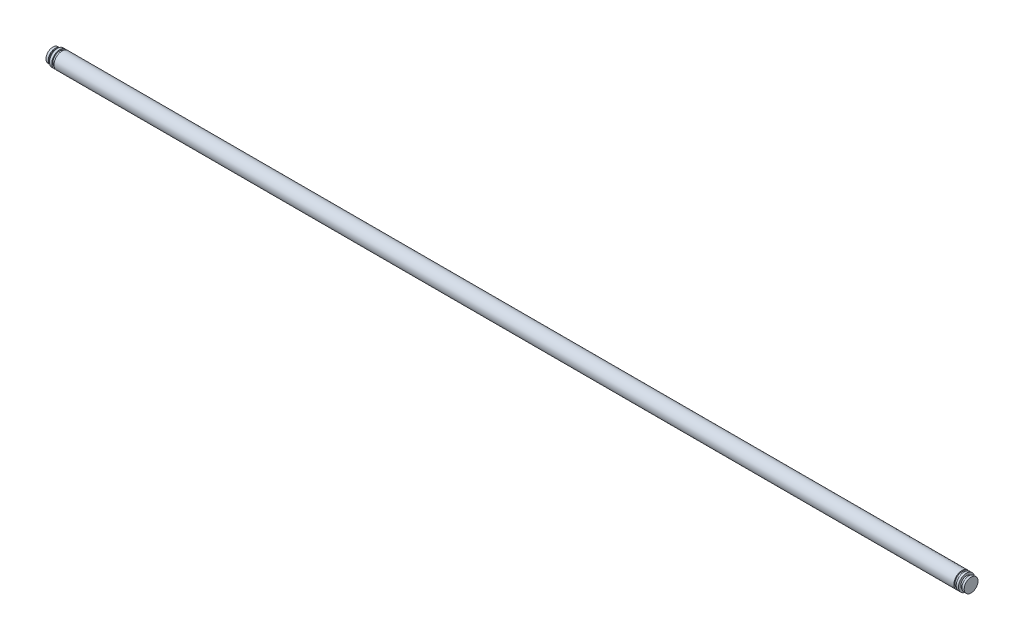
ISO-10303-21;
HEADER;
FILE_DESCRIPTION(('STEP AP214'),'2;1');
FILE_NAME('part.step','',(''),(''),'','','');
FILE_SCHEMA(('AUTOMOTIVE_DESIGN { 1 0 10303 214 1 1 1 1 }'));
ENDSEC;
DATA;
#1=APPLICATION_CONTEXT('core data for automotive mechanical design processes');
#2=APPLICATION_PROTOCOL_DEFINITION('international standard','automotive_design',2000,#1);
#3=PRODUCT_CONTEXT('',#1,'mechanical');
#4=PRODUCT('Part','Part','',(#3));
#5=PRODUCT_RELATED_PRODUCT_CATEGORY('part','',(#4));
#6=PRODUCT_DEFINITION_FORMATION('','',#4);
#7=PRODUCT_DEFINITION_CONTEXT('part definition',#1,'design');
#8=PRODUCT_DEFINITION('design','',#6,#7);
#9=PRODUCT_DEFINITION_SHAPE('','',#8);
#10=(LENGTH_UNIT() NAMED_UNIT(*) SI_UNIT(.MILLI.,.METRE.));
#11=(NAMED_UNIT(*) PLANE_ANGLE_UNIT() SI_UNIT($,.RADIAN.));
#12=(NAMED_UNIT(*) SI_UNIT($,.STERADIAN.) SOLID_ANGLE_UNIT());
#13=UNCERTAINTY_MEASURE_WITH_UNIT(LENGTH_MEASURE(1.E-05),#10,'distance_accuracy_value','');
#14=(GEOMETRIC_REPRESENTATION_CONTEXT(3) GLOBAL_UNCERTAINTY_ASSIGNED_CONTEXT((#13)) GLOBAL_UNIT_ASSIGNED_CONTEXT((#10,
#11,#12)) REPRESENTATION_CONTEXT('',''));
#15=CARTESIAN_POINT('',(0.,0.,0.));
#16=DIRECTION('',(0.,0.,1.));
#17=DIRECTION('',(1.,0.,0.));
#18=AXIS2_PLACEMENT_3D('',#15,#16,#17);
#19=CARTESIAN_POINT('',(196.,0.,0.));
#20=DIRECTION('',(-1.,0.,0.));
#21=DIRECTION('',(0.,0.,1.));
#22=AXIS2_PLACEMENT_3D('',#19,#20,#21);
#23=CYLINDRICAL_SURFACE('',#22,3.5);
#24=CARTESIAN_POINT('',(196.,0.,0.));
#25=DIRECTION('',(1.,0.,0.));
#26=DIRECTION('',(0.,0.,-1.));
#27=AXIS2_PLACEMENT_3D('',#24,#25,#26);
#28=CIRCLE('',#27,3.5);
#29=CARTESIAN_POINT('',(196.,0.,-3.5));
#30=VERTEX_POINT('',#29);
#31=EDGE_CURVE('E103',#30,#30,#28,.T.);
#32=ORIENTED_EDGE('',*,*,#31,.F.);
#33=EDGE_LOOP('',(#32));
#34=FACE_BOUND('',#33,.T.);
#35=CARTESIAN_POINT('',(-196.,0.,0.));
#36=DIRECTION('',(1.,0.,0.));
#37=DIRECTION('',(0.,0.,-1.));
#38=AXIS2_PLACEMENT_3D('',#35,#36,#37);
#39=CIRCLE('',#38,3.5);
#40=CARTESIAN_POINT('',(-196.,0.,-3.5));
#41=VERTEX_POINT('',#40);
#42=EDGE_CURVE('E44',#41,#41,#39,.T.);
#43=ORIENTED_EDGE('',*,*,#42,.T.);
#44=EDGE_LOOP('',(#43));
#45=FACE_BOUND('',#44,.T.);
#46=ADVANCED_FACE('F41',(#34,#45),#23,.T.);
#47=CARTESIAN_POINT('',(196.,0.,0.));
#48=DIRECTION('',(1.,0.,0.));
#49=DIRECTION('',(0.,0.,-1.));
#50=AXIS2_PLACEMENT_3D('',#47,#48,#49);
#51=PLANE('',#50);
#52=CARTESIAN_POINT('',(196.,0.,0.));
#53=DIRECTION('',(1.,0.,0.));
#54=DIRECTION('',(0.,0.,-1.));
#55=AXIS2_PLACEMENT_3D('',#52,#53,#54);
#56=CIRCLE('',#55,2.99942848463352);
#57=CARTESIAN_POINT('',(196.,0.,-2.99942848463352));
#58=VERTEX_POINT('',#57);
#59=EDGE_CURVE('E89',#58,#58,#56,.T.);
#60=ORIENTED_EDGE('',*,*,#59,.F.);
#61=EDGE_LOOP('',(#60));
#62=FACE_BOUND('',#61,.T.);
#63=ORIENTED_EDGE('',*,*,#31,.T.);
#64=EDGE_LOOP('',(#63));
#65=FACE_BOUND('',#64,.T.);
#66=ADVANCED_FACE('F116',(#62,#65),#51,.T.);
#67=CARTESIAN_POINT('',(-196.,0.,0.));
#68=DIRECTION('',(1.,0.,0.));
#69=DIRECTION('',(0.,0.,-1.));
#70=AXIS2_PLACEMENT_3D('',#67,#68,#69);
#71=PLANE('',#70);
#72=CARTESIAN_POINT('',(-196.,0.,0.));
#73=DIRECTION('',(-1.,0.,0.));
#74=DIRECTION('',(0.,0.,1.));
#75=AXIS2_PLACEMENT_3D('',#72,#73,#74);
#76=CIRCLE('',#75,2.99996498313093);
#77=CARTESIAN_POINT('',(-196.,0.,2.99996498313093));
#78=VERTEX_POINT('',#77);
#79=EDGE_CURVE('E49',#78,#78,#76,.T.);
#80=ORIENTED_EDGE('',*,*,#79,.F.);
#81=EDGE_LOOP('',(#80));
#82=FACE_BOUND('',#81,.T.);
#83=ORIENTED_EDGE('',*,*,#42,.F.);
#84=EDGE_LOOP('',(#83));
#85=FACE_BOUND('',#84,.T.);
#86=ADVANCED_FACE('F113',(#82,#85),#71,.F.);
#87=CARTESIAN_POINT('',(197.,0.,0.));
#88=DIRECTION('',(-1.,0.,0.));
#89=DIRECTION('',(0.,0.,1.));
#90=AXIS2_PLACEMENT_3D('',#87,#88,#89);
#91=CYLINDRICAL_SURFACE('',#90,2.99942848463352);
#92=CARTESIAN_POINT('',(197.,0.,0.));
#93=DIRECTION('',(1.,0.,0.));
#94=DIRECTION('',(0.,0.,-1.));
#95=AXIS2_PLACEMENT_3D('',#92,#93,#94);
#96=CIRCLE('',#95,2.99942848463352);
#97=CARTESIAN_POINT('',(197.,0.,-2.99942848463352));
#98=VERTEX_POINT('',#97);
#99=EDGE_CURVE('E94',#98,#98,#96,.T.);
#100=ORIENTED_EDGE('',*,*,#99,.F.);
#101=EDGE_LOOP('',(#100));
#102=FACE_BOUND('',#101,.T.);
#103=ORIENTED_EDGE('',*,*,#59,.T.);
#104=EDGE_LOOP('',(#103));
#105=FACE_BOUND('',#104,.T.);
#106=ADVANCED_FACE('F115',(#102,#105),#91,.T.);
#107=CARTESIAN_POINT('',(198.,0.,0.));
#108=DIRECTION('',(-1.,0.,0.));
#109=DIRECTION('',(0.,0.,1.));
#110=AXIS2_PLACEMENT_3D('',#107,#108,#109);
#111=CYLINDRICAL_SURFACE('',#110,3.5);
#112=CARTESIAN_POINT('',(198.,0.,0.));
#113=DIRECTION('',(1.,0.,0.));
#114=DIRECTION('',(0.,0.,-1.));
#115=AXIS2_PLACEMENT_3D('',#112,#113,#114);
#116=CIRCLE('',#115,3.5);
#117=CARTESIAN_POINT('',(198.,0.,-3.5));
#118=VERTEX_POINT('',#117);
#119=EDGE_CURVE('E90',#118,#118,#116,.T.);
#120=ORIENTED_EDGE('',*,*,#119,.F.);
#121=EDGE_LOOP('',(#120));
#122=FACE_BOUND('',#121,.T.);
#123=CARTESIAN_POINT('',(197.,0.,0.));
#124=DIRECTION('',(1.,0.,0.));
#125=DIRECTION('',(0.,0.,-1.));
#126=AXIS2_PLACEMENT_3D('',#123,#124,#125);
#127=CIRCLE('',#126,3.5);
#128=CARTESIAN_POINT('',(197.,0.,-3.5));
#129=VERTEX_POINT('',#128);
#130=EDGE_CURVE('E85',#129,#129,#127,.T.);
#131=ORIENTED_EDGE('',*,*,#130,.T.);
#132=EDGE_LOOP('',(#131));
#133=FACE_BOUND('',#132,.T.);
#134=ADVANCED_FACE('F122',(#122,#133),#111,.T.);
#135=CARTESIAN_POINT('',(198.,0.,0.));
#136=DIRECTION('',(1.,0.,0.));
#137=DIRECTION('',(0.,0.,-1.));
#138=AXIS2_PLACEMENT_3D('',#135,#136,#137);
#139=PLANE('',#138);
#140=CARTESIAN_POINT('',(198.,0.,0.));
#141=DIRECTION('',(1.,0.,0.));
#142=DIRECTION('',(0.,0.,-1.));
#143=AXIS2_PLACEMENT_3D('',#140,#141,#142);
#144=CIRCLE('',#143,2.50271341960087);
#145=CARTESIAN_POINT('',(198.,0.,-2.50271341960087));
#146=VERTEX_POINT('',#145);
#147=EDGE_CURVE('E55',#146,#146,#144,.T.);
#148=ORIENTED_EDGE('',*,*,#147,.F.);
#149=EDGE_LOOP('',(#148));
#150=FACE_BOUND('',#149,.T.);
#151=ORIENTED_EDGE('',*,*,#119,.T.);
#152=EDGE_LOOP('',(#151));
#153=FACE_BOUND('',#152,.T.);
#154=ADVANCED_FACE('F154',(#150,#153),#139,.T.);
#155=CARTESIAN_POINT('',(197.,0.,0.));
#156=DIRECTION('',(1.,0.,0.));
#157=DIRECTION('',(0.,0.,-1.));
#158=AXIS2_PLACEMENT_3D('',#155,#156,#157);
#159=PLANE('',#158);
#160=ORIENTED_EDGE('',*,*,#99,.T.);
#161=EDGE_LOOP('',(#160));
#162=FACE_BOUND('',#161,.T.);
#163=ORIENTED_EDGE('',*,*,#130,.F.);
#164=EDGE_LOOP('',(#163));
#165=FACE_BOUND('',#164,.T.);
#166=ADVANCED_FACE('F163',(#162,#165),#159,.F.);
#167=CARTESIAN_POINT('',(199.,0.,0.));
#168=DIRECTION('',(-1.,0.,0.));
#169=DIRECTION('',(0.,0.,1.));
#170=AXIS2_PLACEMENT_3D('',#167,#168,#169);
#171=CYLINDRICAL_SURFACE('',#170,2.50271341960087);
#172=CARTESIAN_POINT('',(199.,0.,0.));
#173=DIRECTION('',(1.,0.,0.));
#174=DIRECTION('',(0.,0.,-1.));
#175=AXIS2_PLACEMENT_3D('',#172,#173,#174);
#176=CIRCLE('',#175,2.50271341960087);
#177=CARTESIAN_POINT('',(199.,0.,-2.50271341960087));
#178=VERTEX_POINT('',#177);
#179=EDGE_CURVE('E78',#178,#178,#176,.T.);
#180=ORIENTED_EDGE('',*,*,#179,.F.);
#181=EDGE_LOOP('',(#180));
#182=FACE_BOUND('',#181,.T.);
#183=ORIENTED_EDGE('',*,*,#147,.T.);
#184=EDGE_LOOP('',(#183));
#185=FACE_BOUND('',#184,.T.);
#186=ADVANCED_FACE('F168',(#182,#185),#171,.T.);
#187=CARTESIAN_POINT('',(200.,0.,0.));
#188=DIRECTION('',(-1.,0.,0.));
#189=DIRECTION('',(0.,0.,1.));
#190=AXIS2_PLACEMENT_3D('',#187,#188,#189);
#191=CYLINDRICAL_SURFACE('',#190,3.00421616194073);
#192=CARTESIAN_POINT('',(200.,0.,0.));
#193=DIRECTION('',(1.,0.,0.));
#194=DIRECTION('',(0.,0.,-1.));
#195=AXIS2_PLACEMENT_3D('',#192,#193,#194);
#196=CIRCLE('',#195,3.00421616194073);
#197=CARTESIAN_POINT('',(200.,0.,-3.00421616194073));
#198=VERTEX_POINT('',#197);
#199=EDGE_CURVE('E74',#198,#198,#196,.T.);
#200=ORIENTED_EDGE('',*,*,#199,.F.);
#201=EDGE_LOOP('',(#200));
#202=FACE_BOUND('',#201,.T.);
#203=CARTESIAN_POINT('',(199.,0.,0.));
#204=DIRECTION('',(1.,0.,0.));
#205=DIRECTION('',(0.,0.,-1.));
#206=AXIS2_PLACEMENT_3D('',#203,#204,#205);
#207=CIRCLE('',#206,3.00421616194073);
#208=CARTESIAN_POINT('',(199.,0.,-3.00421616194073));
#209=VERTEX_POINT('',#208);
#210=EDGE_CURVE('E72',#209,#209,#207,.T.);
#211=ORIENTED_EDGE('',*,*,#210,.T.);
#212=EDGE_LOOP('',(#211));
#213=FACE_BOUND('',#212,.T.);
#214=ADVANCED_FACE('F187',(#202,#213),#191,.T.);
#215=CARTESIAN_POINT('',(200.,0.,0.));
#216=DIRECTION('',(1.,0.,0.));
#217=DIRECTION('',(0.,0.,-1.));
#218=AXIS2_PLACEMENT_3D('',#215,#216,#217);
#219=PLANE('',#218);
#220=ORIENTED_EDGE('',*,*,#199,.T.);
#221=EDGE_LOOP('',(#220));
#222=FACE_BOUND('',#221,.T.);
#223=ADVANCED_FACE('F198',(#222),#219,.T.);
#224=CARTESIAN_POINT('',(199.,0.,0.));
#225=DIRECTION('',(1.,0.,0.));
#226=DIRECTION('',(0.,0.,-1.));
#227=AXIS2_PLACEMENT_3D('',#224,#225,#226);
#228=PLANE('',#227);
#229=ORIENTED_EDGE('',*,*,#179,.T.);
#230=EDGE_LOOP('',(#229));
#231=FACE_BOUND('',#230,.T.);
#232=ORIENTED_EDGE('',*,*,#210,.F.);
#233=EDGE_LOOP('',(#232));
#234=FACE_BOUND('',#233,.T.);
#235=ADVANCED_FACE('F209',(#231,#234),#228,.F.);
#236=CARTESIAN_POINT('',(-197.,0.,0.));
#237=DIRECTION('',(1.,0.,0.));
#238=DIRECTION('',(0.,0.,-1.));
#239=AXIS2_PLACEMENT_3D('',#236,#237,#238);
#240=CYLINDRICAL_SURFACE('',#239,2.99996498313093);
#241=CARTESIAN_POINT('',(-197.,0.,0.));
#242=DIRECTION('',(-1.,0.,0.));
#243=DIRECTION('',(0.,0.,1.));
#244=AXIS2_PLACEMENT_3D('',#241,#242,#243);
#245=CIRCLE('',#244,2.99996498313093);
#246=CARTESIAN_POINT('',(-197.,0.,2.99996498313093));
#247=VERTEX_POINT('',#246);
#248=EDGE_CURVE('E65',#247,#247,#245,.T.);
#249=ORIENTED_EDGE('',*,*,#248,.F.);
#250=EDGE_LOOP('',(#249));
#251=FACE_BOUND('',#250,.T.);
#252=ORIENTED_EDGE('',*,*,#79,.T.);
#253=EDGE_LOOP('',(#252));
#254=FACE_BOUND('',#253,.T.);
#255=ADVANCED_FACE('F219',(#251,#254),#240,.T.);
#256=CARTESIAN_POINT('',(-198.,0.,0.));
#257=DIRECTION('',(1.,0.,0.));
#258=DIRECTION('',(0.,0.,-1.));
#259=AXIS2_PLACEMENT_3D('',#256,#257,#258);
#260=CYLINDRICAL_SURFACE('',#259,3.5);
#261=CARTESIAN_POINT('',(-198.,0.,0.));
#262=DIRECTION('',(-1.,0.,0.));
#263=DIRECTION('',(0.,0.,1.));
#264=AXIS2_PLACEMENT_3D('',#261,#262,#263);
#265=CIRCLE('',#264,3.5);
#266=CARTESIAN_POINT('',(-198.,0.,3.5));
#267=VERTEX_POINT('',#266);
#268=EDGE_CURVE('E61',#267,#267,#265,.T.);
#269=ORIENTED_EDGE('',*,*,#268,.F.);
#270=EDGE_LOOP('',(#269));
#271=FACE_BOUND('',#270,.T.);
#272=CARTESIAN_POINT('',(-197.,0.,0.));
#273=DIRECTION('',(-1.,0.,0.));
#274=DIRECTION('',(0.,0.,1.));
#275=AXIS2_PLACEMENT_3D('',#272,#273,#274);
#276=CIRCLE('',#275,3.5);
#277=CARTESIAN_POINT('',(-197.,0.,3.5));
#278=VERTEX_POINT('',#277);
#279=EDGE_CURVE('E66',#278,#278,#276,.T.);
#280=ORIENTED_EDGE('',*,*,#279,.T.);
#281=EDGE_LOOP('',(#280));
#282=FACE_BOUND('',#281,.T.);
#283=ADVANCED_FACE('F235',(#271,#282),#260,.T.);
#284=CARTESIAN_POINT('',(-198.,0.,0.));
#285=DIRECTION('',(-1.,0.,0.));
#286=DIRECTION('',(0.,0.,1.));
#287=AXIS2_PLACEMENT_3D('',#284,#285,#286);
#288=PLANE('',#287);
#289=CARTESIAN_POINT('',(-198.,0.,0.));
#290=DIRECTION('',(-1.,0.,0.));
#291=DIRECTION('',(0.,0.,1.));
#292=AXIS2_PLACEMENT_3D('',#289,#290,#291);
#293=CIRCLE('',#292,2.50477630836932);
#294=CARTESIAN_POINT('',(-198.,0.,2.50477630836932));
#295=VERTEX_POINT('',#294);
#296=EDGE_CURVE('E10',#295,#295,#293,.T.);
#297=ORIENTED_EDGE('',*,*,#296,.F.);
#298=EDGE_LOOP('',(#297));
#299=FACE_BOUND('',#298,.T.);
#300=ORIENTED_EDGE('',*,*,#268,.T.);
#301=EDGE_LOOP('',(#300));
#302=FACE_BOUND('',#301,.T.);
#303=ADVANCED_FACE('F246',(#299,#302),#288,.T.);
#304=CARTESIAN_POINT('',(-197.,0.,0.));
#305=DIRECTION('',(-1.,0.,0.));
#306=DIRECTION('',(0.,0.,1.));
#307=AXIS2_PLACEMENT_3D('',#304,#305,#306);
#308=PLANE('',#307);
#309=ORIENTED_EDGE('',*,*,#248,.T.);
#310=EDGE_LOOP('',(#309));
#311=FACE_BOUND('',#310,.T.);
#312=ORIENTED_EDGE('',*,*,#279,.F.);
#313=EDGE_LOOP('',(#312));
#314=FACE_BOUND('',#313,.T.);
#315=ADVANCED_FACE('F255',(#311,#314),#308,.F.);
#316=CARTESIAN_POINT('',(-199.,0.,0.));
#317=DIRECTION('',(1.,0.,0.));
#318=DIRECTION('',(0.,0.,-1.));
#319=AXIS2_PLACEMENT_3D('',#316,#317,#318);
#320=CYLINDRICAL_SURFACE('',#319,2.50477630836932);
#321=CARTESIAN_POINT('',(-199.,0.,0.));
#322=DIRECTION('',(-1.,0.,0.));
#323=DIRECTION('',(0.,0.,1.));
#324=AXIS2_PLACEMENT_3D('',#321,#322,#323);
#325=CIRCLE('',#324,2.50477630836932);
#326=CARTESIAN_POINT('',(-199.,0.,2.50477630836932));
#327=VERTEX_POINT('',#326);
#328=EDGE_CURVE('E59',#327,#327,#325,.T.);
#329=ORIENTED_EDGE('',*,*,#328,.F.);
#330=EDGE_LOOP('',(#329));
#331=FACE_BOUND('',#330,.T.);
#332=ORIENTED_EDGE('',*,*,#296,.T.);
#333=EDGE_LOOP('',(#332));
#334=FACE_BOUND('',#333,.T.);
#335=ADVANCED_FACE('F260',(#331,#334),#320,.T.);
#336=CARTESIAN_POINT('',(-200.,0.,0.));
#337=DIRECTION('',(1.,0.,0.));
#338=DIRECTION('',(0.,0.,-1.));
#339=AXIS2_PLACEMENT_3D('',#336,#337,#338);
#340=CYLINDRICAL_SURFACE('',#339,3.0027114563565);
#341=CARTESIAN_POINT('',(-200.,0.,0.));
#342=DIRECTION('',(-1.,0.,0.));
#343=DIRECTION('',(0.,0.,1.));
#344=AXIS2_PLACEMENT_3D('',#341,#342,#343);
#345=CIRCLE('',#344,3.0027114563565);
#346=CARTESIAN_POINT('',(-200.,0.,3.0027114563565));
#347=VERTEX_POINT('',#346);
#348=EDGE_CURVE('E347',#347,#347,#345,.T.);
#349=ORIENTED_EDGE('',*,*,#348,.F.);
#350=EDGE_LOOP('',(#349));
#351=FACE_BOUND('',#350,.T.);
#352=CARTESIAN_POINT('',(-199.,0.,0.));
#353=DIRECTION('',(-1.,0.,0.));
#354=DIRECTION('',(0.,0.,1.));
#355=AXIS2_PLACEMENT_3D('',#352,#353,#354);
#356=CIRCLE('',#355,3.0027114563565);
#357=CARTESIAN_POINT('',(-199.,0.,3.0027114563565));
#358=VERTEX_POINT('',#357);
#359=EDGE_CURVE('E344',#358,#358,#356,.T.);
#360=ORIENTED_EDGE('',*,*,#359,.T.);
#361=EDGE_LOOP('',(#360));
#362=FACE_BOUND('',#361,.T.);
#363=ADVANCED_FACE('F279',(#351,#362),#340,.T.);
#364=CARTESIAN_POINT('',(-200.,0.,0.));
#365=DIRECTION('',(-1.,0.,0.));
#366=DIRECTION('',(0.,0.,1.));
#367=AXIS2_PLACEMENT_3D('',#364,#365,#366);
#368=PLANE('',#367);
#369=ORIENTED_EDGE('',*,*,#348,.T.);
#370=EDGE_LOOP('',(#369));
#371=FACE_BOUND('',#370,.T.);
#372=ADVANCED_FACE('F290',(#371),#368,.T.);
#373=CARTESIAN_POINT('',(-199.,0.,0.));
#374=DIRECTION('',(-1.,0.,0.));
#375=DIRECTION('',(0.,0.,1.));
#376=AXIS2_PLACEMENT_3D('',#373,#374,#375);
#377=PLANE('',#376);
#378=ORIENTED_EDGE('',*,*,#328,.T.);
#379=EDGE_LOOP('',(#378));
#380=FACE_BOUND('',#379,.T.);
#381=ORIENTED_EDGE('',*,*,#359,.F.);
#382=EDGE_LOOP('',(#381));
#383=FACE_BOUND('',#382,.T.);
#384=ADVANCED_FACE('F301',(#380,#383),#377,.F.);
#385=CLOSED_SHELL('',(#46,#66,#86,#106,#134,#154,#166,#186,#214,#223,#235,#255,#283,#303,#315,
#335,#363,#372,#384));
#386=MANIFOLD_SOLID_BREP('B2',#385);
#387=ADVANCED_BREP_SHAPE_REPRESENTATION('',(#18,#386),#14);
#388=SHAPE_DEFINITION_REPRESENTATION(#9,#387);
ENDSEC;
END-ISO-10303-21;
